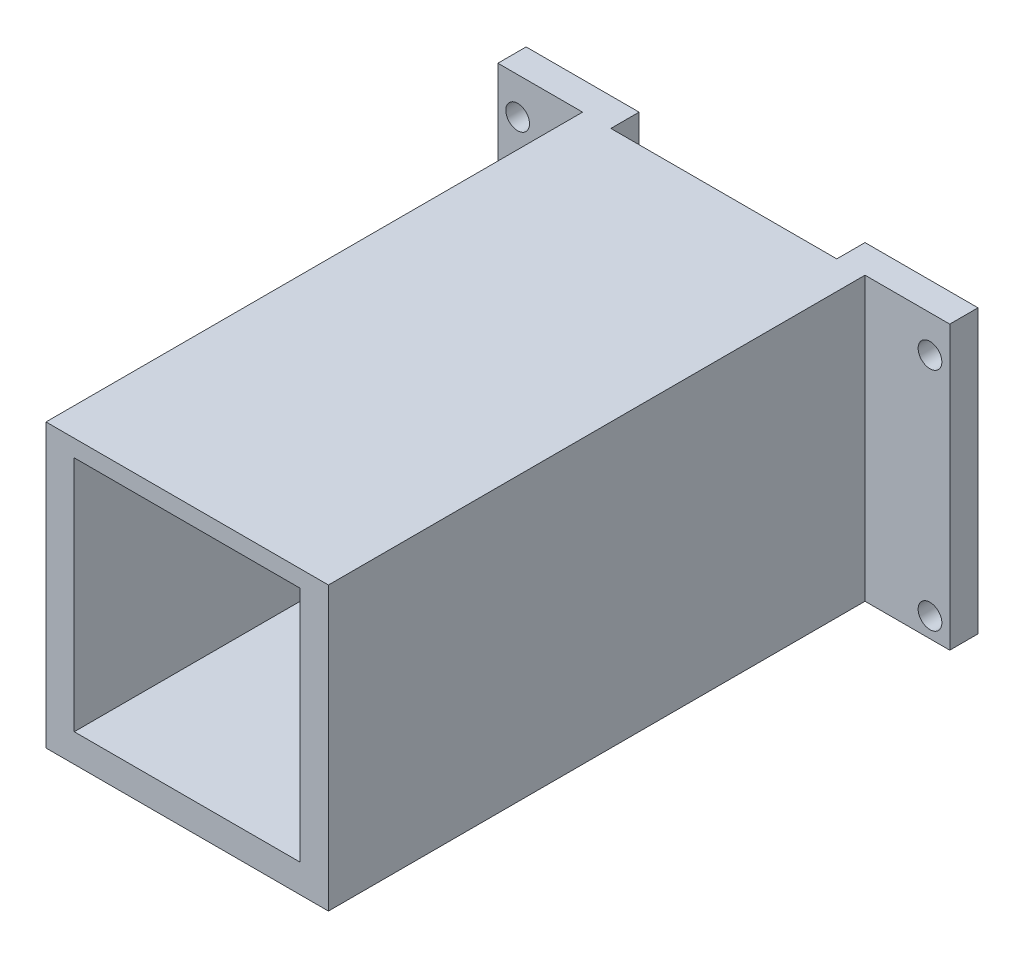
ISO-10303-21;
HEADER;
FILE_DESCRIPTION(('STEP AP214'),'2;1');
FILE_NAME('part.step','',(''),(''),'','','');
FILE_SCHEMA(('AUTOMOTIVE_DESIGN { 1 0 10303 214 1 1 1 1 }'));
ENDSEC;
DATA;
#1=APPLICATION_CONTEXT('core data for automotive mechanical design processes');
#2=APPLICATION_PROTOCOL_DEFINITION('international standard','automotive_design',2000,#1);
#3=PRODUCT_CONTEXT('',#1,'mechanical');
#4=PRODUCT('Part','Part','',(#3));
#5=PRODUCT_RELATED_PRODUCT_CATEGORY('part','',(#4));
#6=PRODUCT_DEFINITION_FORMATION('','',#4);
#7=PRODUCT_DEFINITION_CONTEXT('part definition',#1,'design');
#8=PRODUCT_DEFINITION('design','',#6,#7);
#9=PRODUCT_DEFINITION_SHAPE('','',#8);
#10=(LENGTH_UNIT() NAMED_UNIT(*) SI_UNIT(.MILLI.,.METRE.));
#11=(NAMED_UNIT(*) PLANE_ANGLE_UNIT() SI_UNIT($,.RADIAN.));
#12=(NAMED_UNIT(*) SI_UNIT($,.STERADIAN.) SOLID_ANGLE_UNIT());
#13=UNCERTAINTY_MEASURE_WITH_UNIT(LENGTH_MEASURE(1.E-05),#10,'distance_accuracy_value','');
#14=(GEOMETRIC_REPRESENTATION_CONTEXT(3) GLOBAL_UNCERTAINTY_ASSIGNED_CONTEXT((#13)) GLOBAL_UNIT_ASSIGNED_CONTEXT((#10,
#11,#12)) REPRESENTATION_CONTEXT('',''));
#15=CARTESIAN_POINT('',(0.,0.,0.));
#16=DIRECTION('',(0.,0.,1.));
#17=DIRECTION('',(1.,0.,0.));
#18=AXIS2_PLACEMENT_3D('',#15,#16,#17);
#19=CARTESIAN_POINT('',(0.,0.,0.));
#20=DIRECTION('',(0.,0.,-1.));
#21=DIRECTION('',(-1.,0.,0.));
#22=AXIS2_PLACEMENT_3D('',#19,#20,#21);
#23=PLANE('',#22);
#24=CARTESIAN_POINT('',(76.5,43.5,0.));
#25=DIRECTION('',(0.,0.,1.));
#26=DIRECTION('',(1.,0.,0.));
#27=AXIS2_PLACEMENT_3D('',#24,#25,#26);
#28=CIRCLE('',#27,2.1);
#29=CARTESIAN_POINT('',(78.6,43.5,0.));
#30=VERTEX_POINT('',#29);
#31=EDGE_CURVE('E188',#30,#30,#28,.T.);
#32=ORIENTED_EDGE('',*,*,#31,.T.);
#33=EDGE_LOOP('',(#32));
#34=FACE_BOUND('',#33,.T.);
#35=CARTESIAN_POINT('',(3.5,3.5,0.));
#36=DIRECTION('',(0.,0.,1.));
#37=DIRECTION('',(1.,0.,0.));
#38=AXIS2_PLACEMENT_3D('',#35,#36,#37);
#39=CIRCLE('',#38,2.1);
#40=CARTESIAN_POINT('',(5.6,3.5,0.));
#41=VERTEX_POINT('',#40);
#42=EDGE_CURVE('E290',#41,#41,#39,.T.);
#43=ORIENTED_EDGE('',*,*,#42,.T.);
#44=EDGE_LOOP('',(#43));
#45=FACE_BOUND('',#44,.T.);
#46=CARTESIAN_POINT('',(3.5,43.5,0.));
#47=DIRECTION('',(0.,0.,1.));
#48=DIRECTION('',(1.,0.,0.));
#49=AXIS2_PLACEMENT_3D('',#46,#47,#48);
#50=CIRCLE('',#49,2.1);
#51=CARTESIAN_POINT('',(5.6,43.5,0.));
#52=VERTEX_POINT('',#51);
#53=EDGE_CURVE('E200',#52,#52,#50,.T.);
#54=ORIENTED_EDGE('',*,*,#53,.T.);
#55=EDGE_LOOP('',(#54));
#56=FACE_BOUND('',#55,.T.);
#57=CARTESIAN_POINT('',(76.5,3.5,0.));
#58=DIRECTION('',(0.,0.,1.));
#59=DIRECTION('',(1.,0.,0.));
#60=AXIS2_PLACEMENT_3D('',#57,#58,#59);
#61=CIRCLE('',#60,2.1);
#62=CARTESIAN_POINT('',(78.6,3.5,0.));
#63=VERTEX_POINT('',#62);
#64=EDGE_CURVE('E183',#63,#63,#61,.T.);
#65=ORIENTED_EDGE('',*,*,#64,.T.);
#66=EDGE_LOOP('',(#65));
#67=FACE_BOUND('',#66,.T.);
#68=DIRECTION('',(0.,1.,0.));
#69=VECTOR('',#68,1.);
#70=CARTESIAN_POINT('',(60.,5.,0.));
#71=LINE('',#70,#69);
#72=CARTESIAN_POINT('',(60.,5.,0.));
#73=VERTEX_POINT('',#72);
#74=CARTESIAN_POINT('',(60.,50.,0.));
#75=VERTEX_POINT('',#74);
#76=EDGE_CURVE('E136',#73,#75,#71,.T.);
#77=ORIENTED_EDGE('',*,*,#76,.T.);
#78=DIRECTION('',(-1.,0.,0.));
#79=VECTOR('',#78,1.);
#80=CARTESIAN_POINT('',(0.,50.,0.));
#81=LINE('',#80,#79);
#82=CARTESIAN_POINT('',(80.,50.,0.));
#83=VERTEX_POINT('',#82);
#84=EDGE_CURVE('E140',#83,#75,#81,.T.);
#85=ORIENTED_EDGE('',*,*,#84,.F.);
#86=DIRECTION('',(0.,1.,0.));
#87=VECTOR('',#86,1.);
#88=CARTESIAN_POINT('',(80.,0.,0.));
#89=LINE('',#88,#87);
#90=CARTESIAN_POINT('',(80.,0.,0.));
#91=VERTEX_POINT('',#90);
#92=EDGE_CURVE('E165',#91,#83,#89,.T.);
#93=ORIENTED_EDGE('',*,*,#92,.F.);
#94=DIRECTION('',(1.,0.,0.));
#95=VECTOR('',#94,1.);
#96=CARTESIAN_POINT('',(0.,0.,0.));
#97=LINE('',#96,#95);
#98=CARTESIAN_POINT('',(0.,0.,0.));
#99=VERTEX_POINT('',#98);
#100=EDGE_CURVE('E255',#99,#91,#97,.T.);
#101=ORIENTED_EDGE('',*,*,#100,.F.);
#102=DIRECTION('',(0.,-1.,0.));
#103=VECTOR('',#102,1.);
#104=CARTESIAN_POINT('',(0.,0.,0.));
#105=LINE('',#104,#103);
#106=CARTESIAN_POINT('',(0.,50.,0.));
#107=VERTEX_POINT('',#106);
#108=EDGE_CURVE('E246',#107,#99,#105,.T.);
#109=ORIENTED_EDGE('',*,*,#108,.F.);
#110=CARTESIAN_POINT('',(20.,50.,0.));
#111=VERTEX_POINT('',#110);
#112=EDGE_CURVE('E160',#111,#107,#81,.T.);
#113=ORIENTED_EDGE('',*,*,#112,.F.);
#114=DIRECTION('',(0.,-1.,0.));
#115=VECTOR('',#114,1.);
#116=CARTESIAN_POINT('',(20.,5.,0.));
#117=LINE('',#116,#115);
#118=CARTESIAN_POINT('',(20.,5.,0.));
#119=VERTEX_POINT('',#118);
#120=EDGE_CURVE('E182',#111,#119,#117,.T.);
#121=ORIENTED_EDGE('',*,*,#120,.T.);
#122=DIRECTION('',(1.,0.,0.));
#123=VECTOR('',#122,1.);
#124=CARTESIAN_POINT('',(20.,5.,0.));
#125=LINE('',#124,#123);
#126=EDGE_CURVE('E142',#119,#73,#125,.T.);
#127=ORIENTED_EDGE('',*,*,#126,.T.);
#128=EDGE_LOOP('',(#77,#85,#93,#101,#109,#113,#121,#127));
#129=FACE_BOUND('',#128,.T.);
#130=ADVANCED_FACE('F35',(#34,#45,#56,#67,#129),#23,.T.);
#131=CARTESIAN_POINT('',(0.,50.,5.));
#132=DIRECTION('',(0.,-1.,0.));
#133=DIRECTION('',(0.,0.,-1.));
#134=AXIS2_PLACEMENT_3D('',#131,#132,#133);
#135=PLANE('',#134);
#136=DIRECTION('',(0.,0.,-1.));
#137=VECTOR('',#136,1.);
#138=CARTESIAN_POINT('',(60.,50.,0.));
#139=LINE('',#138,#137);
#140=CARTESIAN_POINT('',(60.,50.,5.));
#141=VERTEX_POINT('',#140);
#142=EDGE_CURVE('E148',#141,#75,#139,.T.);
#143=ORIENTED_EDGE('',*,*,#142,.F.);
#144=DIRECTION('',(1.,0.,0.));
#145=VECTOR('',#144,1.);
#146=CARTESIAN_POINT('',(60.,50.,5.));
#147=LINE('',#146,#145);
#148=CARTESIAN_POINT('',(20.,50.,5.00000000000001));
#149=VERTEX_POINT('',#148);
#150=EDGE_CURVE('E291',#149,#141,#147,.T.);
#151=ORIENTED_EDGE('',*,*,#150,.F.);
#152=DIRECTION('',(0.,0.,1.));
#153=VECTOR('',#152,1.);
#154=CARTESIAN_POINT('',(20.,50.,0.));
#155=LINE('',#154,#153);
#156=EDGE_CURVE('E152',#111,#149,#155,.T.);
#157=ORIENTED_EDGE('',*,*,#156,.F.);
#158=ORIENTED_EDGE('',*,*,#112,.T.);
#159=DIRECTION('',(0.,0.,-1.));
#160=VECTOR('',#159,1.);
#161=CARTESIAN_POINT('',(0.,50.,5.));
#162=LINE('',#161,#160);
#163=CARTESIAN_POINT('',(0.,50.,5.));
#164=VERTEX_POINT('',#163);
#165=EDGE_CURVE('E169',#164,#107,#162,.T.);
#166=ORIENTED_EDGE('',*,*,#165,.F.);
#167=DIRECTION('',(-1.,0.,0.));
#168=VECTOR('',#167,1.);
#169=CARTESIAN_POINT('',(0.,50.,5.));
#170=LINE('',#169,#168);
#171=CARTESIAN_POINT('',(15.,50.,5.));
#172=VERTEX_POINT('',#171);
#173=EDGE_CURVE('E252',#172,#164,#170,.T.);
#174=ORIENTED_EDGE('',*,*,#173,.F.);
#175=DIRECTION('',(0.,0.,-1.));
#176=VECTOR('',#175,1.);
#177=CARTESIAN_POINT('',(15.,50.,100.));
#178=LINE('',#177,#176);
#179=CARTESIAN_POINT('',(15.,50.,100.));
#180=VERTEX_POINT('',#179);
#181=EDGE_CURVE('E229',#180,#172,#178,.T.);
#182=ORIENTED_EDGE('',*,*,#181,.F.);
#183=DIRECTION('',(-1.,0.,0.));
#184=VECTOR('',#183,1.);
#185=CARTESIAN_POINT('',(15.,50.,100.));
#186=LINE('',#185,#184);
#187=CARTESIAN_POINT('',(65.,50.,100.));
#188=VERTEX_POINT('',#187);
#189=EDGE_CURVE('E227',#188,#180,#186,.T.);
#190=ORIENTED_EDGE('',*,*,#189,.F.);
#191=DIRECTION('',(0.,0.,-1.));
#192=VECTOR('',#191,1.);
#193=CARTESIAN_POINT('',(65.,50.,100.));
#194=LINE('',#193,#192);
#195=CARTESIAN_POINT('',(65.,50.,5.));
#196=VERTEX_POINT('',#195);
#197=EDGE_CURVE('E232',#188,#196,#194,.T.);
#198=ORIENTED_EDGE('',*,*,#197,.T.);
#199=CARTESIAN_POINT('',(80.,50.,5.));
#200=VERTEX_POINT('',#199);
#201=EDGE_CURVE('E172',#200,#196,#170,.T.);
#202=ORIENTED_EDGE('',*,*,#201,.F.);
#203=DIRECTION('',(0.,0.,-1.));
#204=VECTOR('',#203,1.);
#205=CARTESIAN_POINT('',(80.,50.,5.));
#206=LINE('',#205,#204);
#207=EDGE_CURVE('E158',#200,#83,#206,.T.);
#208=ORIENTED_EDGE('',*,*,#207,.T.);
#209=ORIENTED_EDGE('',*,*,#84,.T.);
#210=EDGE_LOOP('',(#143,#151,#157,#158,#166,#174,#182,#190,#198,#202,#208,#209));
#211=FACE_BOUND('',#210,.T.);
#212=ADVANCED_FACE('F155',(#211),#135,.F.);
#213=CARTESIAN_POINT('',(20.,47.,100.));
#214=DIRECTION('',(0.,-1.,0.));
#215=DIRECTION('',(0.,0.,-1.));
#216=AXIS2_PLACEMENT_3D('',#213,#214,#215);
#217=PLANE('',#216);
#218=DIRECTION('',(0.,0.,-1.));
#219=VECTOR('',#218,1.);
#220=CARTESIAN_POINT('',(20.,47.,100.));
#221=LINE('',#220,#219);
#222=CARTESIAN_POINT('',(20.,47.,100.));
#223=VERTEX_POINT('',#222);
#224=CARTESIAN_POINT('',(20.,47.,5.00000000000001));
#225=VERTEX_POINT('',#224);
#226=EDGE_CURVE('E209',#223,#225,#221,.T.);
#227=ORIENTED_EDGE('',*,*,#226,.T.);
#228=DIRECTION('',(1.,0.,0.));
#229=VECTOR('',#228,1.);
#230=CARTESIAN_POINT('',(20.,47.,5.));
#231=LINE('',#230,#229);
#232=CARTESIAN_POINT('',(60.,47.,5.));
#233=VERTEX_POINT('',#232);
#234=EDGE_CURVE('E11',#225,#233,#231,.T.);
#235=ORIENTED_EDGE('',*,*,#234,.T.);
#236=DIRECTION('',(0.,0.,-1.));
#237=VECTOR('',#236,1.);
#238=CARTESIAN_POINT('',(60.,47.,100.));
#239=LINE('',#238,#237);
#240=CARTESIAN_POINT('',(60.,47.,100.));
#241=VERTEX_POINT('',#240);
#242=EDGE_CURVE('E56',#241,#233,#239,.T.);
#243=ORIENTED_EDGE('',*,*,#242,.F.);
#244=DIRECTION('',(-1.,0.,0.));
#245=VECTOR('',#244,1.);
#246=CARTESIAN_POINT('',(20.,47.,100.));
#247=LINE('',#246,#245);
#248=EDGE_CURVE('E207',#241,#223,#247,.T.);
#249=ORIENTED_EDGE('',*,*,#248,.T.);
#250=EDGE_LOOP('',(#227,#235,#243,#249));
#251=FACE_BOUND('',#250,.T.);
#252=ADVANCED_FACE('F284',(#251),#217,.T.);
#253=CARTESIAN_POINT('',(0.,0.,100.));
#254=DIRECTION('',(0.,0.,-1.));
#255=DIRECTION('',(-1.,0.,0.));
#256=AXIS2_PLACEMENT_3D('',#253,#254,#255);
#257=PLANE('',#256);
#258=DIRECTION('',(0.,-1.,0.));
#259=VECTOR('',#258,1.);
#260=CARTESIAN_POINT('',(15.,0.,100.));
#261=LINE('',#260,#259);
#262=CARTESIAN_POINT('',(15.,0.,100.));
#263=VERTEX_POINT('',#262);
#264=EDGE_CURVE('E220',#180,#263,#261,.T.);
#265=ORIENTED_EDGE('',*,*,#264,.T.);
#266=DIRECTION('',(1.,0.,0.));
#267=VECTOR('',#266,1.);
#268=CARTESIAN_POINT('',(15.,0.,100.));
#269=LINE('',#268,#267);
#270=CARTESIAN_POINT('',(65.,0.,100.));
#271=VERTEX_POINT('',#270);
#272=EDGE_CURVE('E223',#263,#271,#269,.T.);
#273=ORIENTED_EDGE('',*,*,#272,.T.);
#274=DIRECTION('',(0.,1.,0.));
#275=VECTOR('',#274,1.);
#276=CARTESIAN_POINT('',(65.,0.,100.));
#277=LINE('',#276,#275);
#278=EDGE_CURVE('E225',#271,#188,#277,.T.);
#279=ORIENTED_EDGE('',*,*,#278,.T.);
#280=ORIENTED_EDGE('',*,*,#189,.T.);
#281=EDGE_LOOP('',(#265,#273,#279,#280));
#282=FACE_BOUND('',#281,.T.);
#283=DIRECTION('',(0.,-1.,0.));
#284=VECTOR('',#283,1.);
#285=CARTESIAN_POINT('',(20.,5.,100.));
#286=LINE('',#285,#284);
#287=CARTESIAN_POINT('',(20.,5.,100.));
#288=VERTEX_POINT('',#287);
#289=EDGE_CURVE('E145',#223,#288,#286,.T.);
#290=ORIENTED_EDGE('',*,*,#289,.F.);
#291=ORIENTED_EDGE('',*,*,#248,.F.);
#292=DIRECTION('',(0.,1.,0.));
#293=VECTOR('',#292,1.);
#294=CARTESIAN_POINT('',(60.,5.,100.));
#295=LINE('',#294,#293);
#296=CARTESIAN_POINT('',(60.,5.,100.));
#297=VERTEX_POINT('',#296);
#298=EDGE_CURVE('E205',#297,#241,#295,.T.);
#299=ORIENTED_EDGE('',*,*,#298,.F.);
#300=DIRECTION('',(1.,0.,0.));
#301=VECTOR('',#300,1.);
#302=CARTESIAN_POINT('',(20.,5.,100.));
#303=LINE('',#302,#301);
#304=EDGE_CURVE('E203',#288,#297,#303,.T.);
#305=ORIENTED_EDGE('',*,*,#304,.F.);
#306=EDGE_LOOP('',(#290,#291,#299,#305));
#307=FACE_BOUND('',#306,.T.);
#308=ADVANCED_FACE('F282',(#282,#307),#257,.F.);
#309=CARTESIAN_POINT('',(0.,0.,5.));
#310=DIRECTION('',(0.,0.,-1.));
#311=DIRECTION('',(-1.,0.,0.));
#312=AXIS2_PLACEMENT_3D('',#309,#310,#311);
#313=PLANE('',#312);
#314=CARTESIAN_POINT('',(3.5,3.5,5.));
#315=DIRECTION('',(0.,0.,-1.));
#316=DIRECTION('',(-1.,0.,0.));
#317=AXIS2_PLACEMENT_3D('',#314,#315,#316);
#318=CIRCLE('',#317,2.1);
#319=CARTESIAN_POINT('',(1.4,3.5,5.));
#320=VERTEX_POINT('',#319);
#321=EDGE_CURVE('E190',#320,#320,#318,.F.);
#322=ORIENTED_EDGE('',*,*,#321,.F.);
#323=EDGE_LOOP('',(#322));
#324=FACE_BOUND('',#323,.T.);
#325=CARTESIAN_POINT('',(3.5,43.5,5.));
#326=DIRECTION('',(0.,0.,-1.));
#327=DIRECTION('',(-1.,0.,0.));
#328=AXIS2_PLACEMENT_3D('',#325,#326,#327);
#329=CIRCLE('',#328,2.1);
#330=CARTESIAN_POINT('',(1.4,43.5,5.));
#331=VERTEX_POINT('',#330);
#332=EDGE_CURVE('E187',#331,#331,#329,.F.);
#333=ORIENTED_EDGE('',*,*,#332,.F.);
#334=EDGE_LOOP('',(#333));
#335=FACE_BOUND('',#334,.T.);
#336=DIRECTION('',(0.,-1.,0.));
#337=VECTOR('',#336,1.);
#338=CARTESIAN_POINT('',(15.,0.,5.));
#339=LINE('',#338,#337);
#340=CARTESIAN_POINT('',(15.,0.,5.));
#341=VERTEX_POINT('',#340);
#342=EDGE_CURVE('E244',#172,#341,#339,.T.);
#343=ORIENTED_EDGE('',*,*,#342,.F.);
#344=ORIENTED_EDGE('',*,*,#173,.T.);
#345=DIRECTION('',(0.,-1.,0.));
#346=VECTOR('',#345,1.);
#347=CARTESIAN_POINT('',(0.,0.,5.));
#348=LINE('',#347,#346);
#349=CARTESIAN_POINT('',(0.,0.,5.));
#350=VERTEX_POINT('',#349);
#351=EDGE_CURVE('E159',#164,#350,#348,.T.);
#352=ORIENTED_EDGE('',*,*,#351,.T.);
#353=DIRECTION('',(1.,0.,0.));
#354=VECTOR('',#353,1.);
#355=CARTESIAN_POINT('',(0.,0.,5.));
#356=LINE('',#355,#354);
#357=EDGE_CURVE('E248',#350,#341,#356,.T.);
#358=ORIENTED_EDGE('',*,*,#357,.T.);
#359=EDGE_LOOP('',(#343,#344,#352,#358));
#360=FACE_BOUND('',#359,.T.);
#361=ADVANCED_FACE('F322',(#324,#335,#360),#313,.F.);
#362=CARTESIAN_POINT('',(76.5,43.5,5.));
#363=DIRECTION('',(0.,0.,-1.));
#364=DIRECTION('',(-1.,0.,0.));
#365=AXIS2_PLACEMENT_3D('',#362,#363,#364);
#366=CIRCLE('',#365,2.1);
#367=CARTESIAN_POINT('',(74.4,43.5,5.));
#368=VERTEX_POINT('',#367);
#369=EDGE_CURVE('E184',#368,#368,#366,.F.);
#370=ORIENTED_EDGE('',*,*,#369,.F.);
#371=EDGE_LOOP('',(#370));
#372=FACE_BOUND('',#371,.T.);
#373=CARTESIAN_POINT('',(76.5,3.5,5.));
#374=DIRECTION('',(0.,0.,-1.));
#375=DIRECTION('',(-1.,0.,0.));
#376=AXIS2_PLACEMENT_3D('',#373,#374,#375);
#377=CIRCLE('',#376,2.1);
#378=CARTESIAN_POINT('',(74.4,3.5,5.));
#379=VERTEX_POINT('',#378);
#380=EDGE_CURVE('E179',#379,#379,#377,.F.);
#381=ORIENTED_EDGE('',*,*,#380,.F.);
#382=EDGE_LOOP('',(#381));
#383=FACE_BOUND('',#382,.T.);
#384=DIRECTION('',(0.,1.,0.));
#385=VECTOR('',#384,1.);
#386=CARTESIAN_POINT('',(65.,0.,5.));
#387=LINE('',#386,#385);
#388=CARTESIAN_POINT('',(65.,0.,5.));
#389=VERTEX_POINT('',#388);
#390=EDGE_CURVE('E241',#389,#196,#387,.T.);
#391=ORIENTED_EDGE('',*,*,#390,.F.);
#392=CARTESIAN_POINT('',(80.,0.,5.));
#393=VERTEX_POINT('',#392);
#394=EDGE_CURVE('E163',#389,#393,#356,.T.);
#395=ORIENTED_EDGE('',*,*,#394,.T.);
#396=DIRECTION('',(0.,1.,0.));
#397=VECTOR('',#396,1.);
#398=CARTESIAN_POINT('',(80.,0.,5.));
#399=LINE('',#398,#397);
#400=EDGE_CURVE('E250',#393,#200,#399,.T.);
#401=ORIENTED_EDGE('',*,*,#400,.T.);
#402=ORIENTED_EDGE('',*,*,#201,.T.);
#403=EDGE_LOOP('',(#391,#395,#401,#402));
#404=FACE_BOUND('',#403,.T.);
#405=ADVANCED_FACE('F331',(#372,#383,#404),#313,.F.);
#406=CARTESIAN_POINT('',(0.,0.,5.));
#407=DIRECTION('',(1.,0.,0.));
#408=DIRECTION('',(0.,0.,-1.));
#409=AXIS2_PLACEMENT_3D('',#406,#407,#408);
#410=PLANE('',#409);
#411=ORIENTED_EDGE('',*,*,#108,.T.);
#412=DIRECTION('',(0.,0.,-1.));
#413=VECTOR('',#412,1.);
#414=CARTESIAN_POINT('',(0.,0.,5.));
#415=LINE('',#414,#413);
#416=EDGE_CURVE('E43',#350,#99,#415,.T.);
#417=ORIENTED_EDGE('',*,*,#416,.F.);
#418=ORIENTED_EDGE('',*,*,#351,.F.);
#419=ORIENTED_EDGE('',*,*,#165,.T.);
#420=EDGE_LOOP('',(#411,#417,#418,#419));
#421=FACE_BOUND('',#420,.T.);
#422=ADVANCED_FACE('F37',(#421),#410,.F.);
#423=CARTESIAN_POINT('',(0.,0.,5.));
#424=DIRECTION('',(0.,1.,0.));
#425=DIRECTION('',(0.,0.,1.));
#426=AXIS2_PLACEMENT_3D('',#423,#424,#425);
#427=PLANE('',#426);
#428=ORIENTED_EDGE('',*,*,#100,.T.);
#429=DIRECTION('',(0.,0.,-1.));
#430=VECTOR('',#429,1.);
#431=CARTESIAN_POINT('',(80.,0.,5.));
#432=LINE('',#431,#430);
#433=EDGE_CURVE('E174',#393,#91,#432,.T.);
#434=ORIENTED_EDGE('',*,*,#433,.F.);
#435=ORIENTED_EDGE('',*,*,#394,.F.);
#436=DIRECTION('',(0.,0.,-1.));
#437=VECTOR('',#436,1.);
#438=CARTESIAN_POINT('',(65.,0.,100.));
#439=LINE('',#438,#437);
#440=EDGE_CURVE('E235',#271,#389,#439,.T.);
#441=ORIENTED_EDGE('',*,*,#440,.F.);
#442=ORIENTED_EDGE('',*,*,#272,.F.);
#443=DIRECTION('',(0.,0.,-1.));
#444=VECTOR('',#443,1.);
#445=CARTESIAN_POINT('',(15.,0.,100.));
#446=LINE('',#445,#444);
#447=EDGE_CURVE('E238',#263,#341,#446,.T.);
#448=ORIENTED_EDGE('',*,*,#447,.T.);
#449=ORIENTED_EDGE('',*,*,#357,.F.);
#450=ORIENTED_EDGE('',*,*,#416,.T.);
#451=EDGE_LOOP('',(#428,#434,#435,#441,#442,#448,#449,#450));
#452=FACE_BOUND('',#451,.T.);
#453=ADVANCED_FACE('F264',(#452),#427,.F.);
#454=CARTESIAN_POINT('',(80.,0.,5.));
#455=DIRECTION('',(-1.,0.,0.));
#456=DIRECTION('',(0.,0.,1.));
#457=AXIS2_PLACEMENT_3D('',#454,#455,#456);
#458=PLANE('',#457);
#459=ORIENTED_EDGE('',*,*,#92,.T.);
#460=ORIENTED_EDGE('',*,*,#207,.F.);
#461=ORIENTED_EDGE('',*,*,#400,.F.);
#462=ORIENTED_EDGE('',*,*,#433,.T.);
#463=EDGE_LOOP('',(#459,#460,#461,#462));
#464=FACE_BOUND('',#463,.T.);
#465=ADVANCED_FACE('F259',(#464),#458,.F.);
#466=CARTESIAN_POINT('',(15.,0.,100.));
#467=DIRECTION('',(1.,0.,0.));
#468=DIRECTION('',(0.,0.,-1.));
#469=AXIS2_PLACEMENT_3D('',#466,#467,#468);
#470=PLANE('',#469);
#471=ORIENTED_EDGE('',*,*,#181,.T.);
#472=ORIENTED_EDGE('',*,*,#342,.T.);
#473=ORIENTED_EDGE('',*,*,#447,.F.);
#474=ORIENTED_EDGE('',*,*,#264,.F.);
#475=EDGE_LOOP('',(#471,#472,#473,#474));
#476=FACE_BOUND('',#475,.T.);
#477=ADVANCED_FACE('F326',(#476),#470,.F.);
#478=CARTESIAN_POINT('',(65.,0.,100.));
#479=DIRECTION('',(-1.,0.,0.));
#480=DIRECTION('',(0.,0.,1.));
#481=AXIS2_PLACEMENT_3D('',#478,#479,#480);
#482=PLANE('',#481);
#483=ORIENTED_EDGE('',*,*,#440,.T.);
#484=ORIENTED_EDGE('',*,*,#390,.T.);
#485=ORIENTED_EDGE('',*,*,#197,.F.);
#486=ORIENTED_EDGE('',*,*,#278,.F.);
#487=EDGE_LOOP('',(#483,#484,#485,#486));
#488=FACE_BOUND('',#487,.T.);
#489=ADVANCED_FACE('F349',(#488),#482,.F.);
#490=CARTESIAN_POINT('',(20.,5.,100.));
#491=DIRECTION('',(1.,0.,0.));
#492=DIRECTION('',(0.,0.,-1.));
#493=AXIS2_PLACEMENT_3D('',#490,#491,#492);
#494=PLANE('',#493);
#495=DIRECTION('',(0.,-1.,0.));
#496=VECTOR('',#495,1.);
#497=CARTESIAN_POINT('',(20.,50.,5.00000000000001));
#498=LINE('',#497,#496);
#499=EDGE_CURVE('E287',#149,#225,#498,.T.);
#500=ORIENTED_EDGE('',*,*,#499,.T.);
#501=ORIENTED_EDGE('',*,*,#226,.F.);
#502=ORIENTED_EDGE('',*,*,#289,.T.);
#503=DIRECTION('',(0.,0.,-1.));
#504=VECTOR('',#503,1.);
#505=CARTESIAN_POINT('',(20.,5.,100.));
#506=LINE('',#505,#504);
#507=EDGE_CURVE('E217',#288,#119,#506,.T.);
#508=ORIENTED_EDGE('',*,*,#507,.T.);
#509=ORIENTED_EDGE('',*,*,#120,.F.);
#510=ORIENTED_EDGE('',*,*,#156,.T.);
#511=EDGE_LOOP('',(#500,#501,#502,#508,#509,#510));
#512=FACE_BOUND('',#511,.T.);
#513=ADVANCED_FACE('F277',(#512),#494,.T.);
#514=CARTESIAN_POINT('',(20.,5.,100.));
#515=DIRECTION('',(0.,1.,0.));
#516=DIRECTION('',(0.,0.,1.));
#517=AXIS2_PLACEMENT_3D('',#514,#515,#516);
#518=PLANE('',#517);
#519=ORIENTED_EDGE('',*,*,#126,.F.);
#520=ORIENTED_EDGE('',*,*,#507,.F.);
#521=ORIENTED_EDGE('',*,*,#304,.T.);
#522=DIRECTION('',(0.,0.,-1.));
#523=VECTOR('',#522,1.);
#524=CARTESIAN_POINT('',(60.,5.,100.));
#525=LINE('',#524,#523);
#526=EDGE_CURVE('E215',#297,#73,#525,.T.);
#527=ORIENTED_EDGE('',*,*,#526,.T.);
#528=EDGE_LOOP('',(#519,#520,#521,#527));
#529=FACE_BOUND('',#528,.T.);
#530=ADVANCED_FACE('F274',(#529),#518,.T.);
#531=CARTESIAN_POINT('',(60.,5.,100.));
#532=DIRECTION('',(-1.,0.,0.));
#533=DIRECTION('',(0.,0.,1.));
#534=AXIS2_PLACEMENT_3D('',#531,#532,#533);
#535=PLANE('',#534);
#536=ORIENTED_EDGE('',*,*,#242,.T.);
#537=DIRECTION('',(0.,-1.,0.));
#538=VECTOR('',#537,1.);
#539=CARTESIAN_POINT('',(60.,50.,5.));
#540=LINE('',#539,#538);
#541=EDGE_CURVE('E50',#141,#233,#540,.T.);
#542=ORIENTED_EDGE('',*,*,#541,.F.);
#543=ORIENTED_EDGE('',*,*,#142,.T.);
#544=ORIENTED_EDGE('',*,*,#76,.F.);
#545=ORIENTED_EDGE('',*,*,#526,.F.);
#546=ORIENTED_EDGE('',*,*,#298,.T.);
#547=EDGE_LOOP('',(#536,#542,#543,#544,#545,#546));
#548=FACE_BOUND('',#547,.T.);
#549=ADVANCED_FACE('F149',(#548),#535,.T.);
#550=CARTESIAN_POINT('',(76.5,3.5,10.));
#551=DIRECTION('',(0.,0.,-1.));
#552=DIRECTION('',(-1.,0.,0.));
#553=AXIS2_PLACEMENT_3D('',#550,#551,#552);
#554=CYLINDRICAL_SURFACE('',#553,2.1);
#555=ORIENTED_EDGE('',*,*,#64,.F.);
#556=EDGE_LOOP('',(#555));
#557=FACE_BOUND('',#556,.T.);
#558=ORIENTED_EDGE('',*,*,#380,.T.);
#559=EDGE_LOOP('',(#558));
#560=FACE_BOUND('',#559,.T.);
#561=ADVANCED_FACE('F370',(#557,#560),#554,.F.);
#562=CARTESIAN_POINT('',(76.5,43.5,10.));
#563=DIRECTION('',(0.,0.,-1.));
#564=DIRECTION('',(-1.,0.,0.));
#565=AXIS2_PLACEMENT_3D('',#562,#563,#564);
#566=CYLINDRICAL_SURFACE('',#565,2.1);
#567=ORIENTED_EDGE('',*,*,#31,.F.);
#568=EDGE_LOOP('',(#567));
#569=FACE_BOUND('',#568,.T.);
#570=ORIENTED_EDGE('',*,*,#369,.T.);
#571=EDGE_LOOP('',(#570));
#572=FACE_BOUND('',#571,.T.);
#573=ADVANCED_FACE('F310',(#569,#572),#566,.F.);
#574=CARTESIAN_POINT('',(3.5,43.5,10.));
#575=DIRECTION('',(0.,0.,-1.));
#576=DIRECTION('',(-1.,0.,0.));
#577=AXIS2_PLACEMENT_3D('',#574,#575,#576);
#578=CYLINDRICAL_SURFACE('',#577,2.1);
#579=ORIENTED_EDGE('',*,*,#53,.F.);
#580=EDGE_LOOP('',(#579));
#581=FACE_BOUND('',#580,.T.);
#582=ORIENTED_EDGE('',*,*,#332,.T.);
#583=EDGE_LOOP('',(#582));
#584=FACE_BOUND('',#583,.T.);
#585=ADVANCED_FACE('F303',(#581,#584),#578,.F.);
#586=CARTESIAN_POINT('',(3.5,3.5,10.));
#587=DIRECTION('',(0.,0.,-1.));
#588=DIRECTION('',(-1.,0.,0.));
#589=AXIS2_PLACEMENT_3D('',#586,#587,#588);
#590=CYLINDRICAL_SURFACE('',#589,2.1);
#591=ORIENTED_EDGE('',*,*,#42,.F.);
#592=EDGE_LOOP('',(#591));
#593=FACE_BOUND('',#592,.T.);
#594=ORIENTED_EDGE('',*,*,#321,.T.);
#595=EDGE_LOOP('',(#594));
#596=FACE_BOUND('',#595,.T.);
#597=ADVANCED_FACE('F301',(#593,#596),#590,.F.);
#598=CARTESIAN_POINT('',(60.,50.,5.));
#599=DIRECTION('',(0.,0.,-1.));
#600=DIRECTION('',(-1.,0.,0.));
#601=AXIS2_PLACEMENT_3D('',#598,#599,#600);
#602=PLANE('',#601);
#603=ORIENTED_EDGE('',*,*,#499,.F.);
#604=ORIENTED_EDGE('',*,*,#150,.T.);
#605=ORIENTED_EDGE('',*,*,#541,.T.);
#606=ORIENTED_EDGE('',*,*,#234,.F.);
#607=EDGE_LOOP('',(#603,#604,#605,#606));
#608=FACE_BOUND('',#607,.T.);
#609=ADVANCED_FACE('F286',(#608),#602,.T.);
#610=CLOSED_SHELL('',(#130,#212,#252,#308,#361,#405,#422,#453,#465,#477,#489,#513,#530,#549,
#561,#573,#585,#597,#609));
#611=MANIFOLD_SOLID_BREP('B2',#610);
#612=ADVANCED_BREP_SHAPE_REPRESENTATION('',(#18,#611),#14);
#613=SHAPE_DEFINITION_REPRESENTATION(#9,#612);
ENDSEC;
END-ISO-10303-21;
